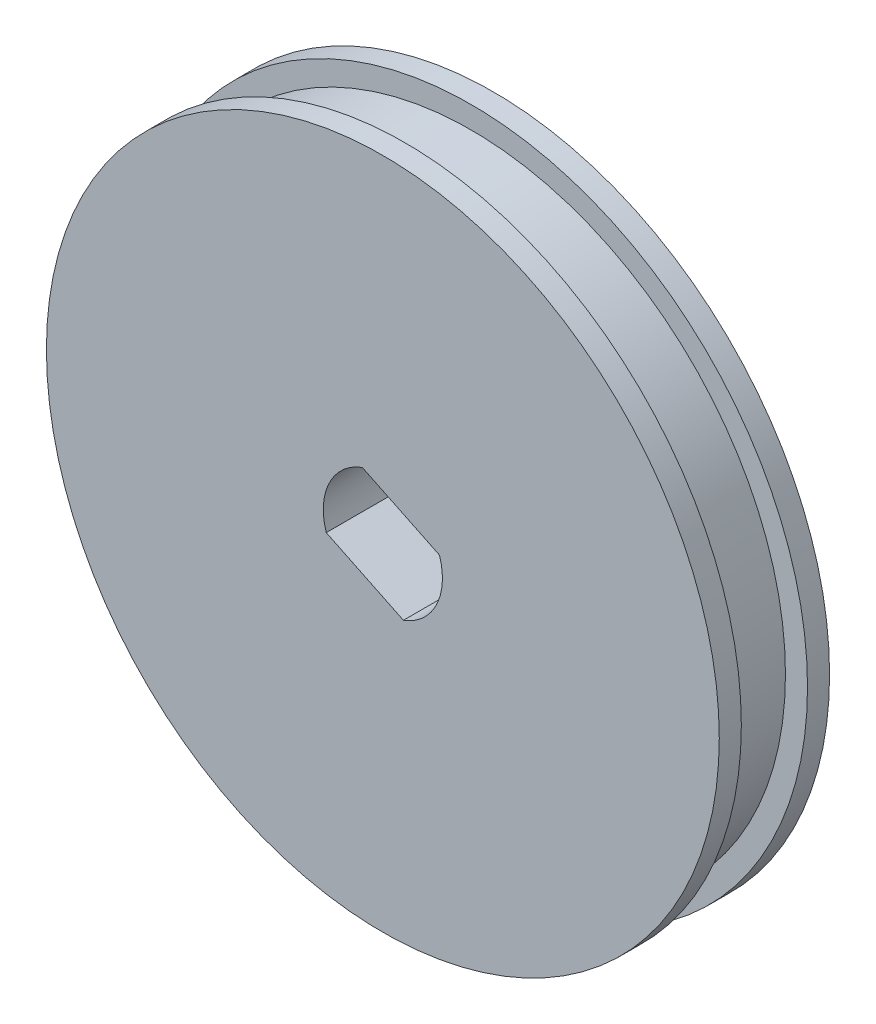
ISO-10303-21;
HEADER;
FILE_DESCRIPTION(('STEP AP214'),'2;1');
FILE_NAME('part.step','',(''),(''),'','','');
FILE_SCHEMA(('AUTOMOTIVE_DESIGN { 1 0 10303 214 1 1 1 1 }'));
ENDSEC;
DATA;
#1=APPLICATION_CONTEXT('core data for automotive mechanical design processes');
#2=APPLICATION_PROTOCOL_DEFINITION('international standard','automotive_design',2000,#1);
#3=PRODUCT_CONTEXT('',#1,'mechanical');
#4=PRODUCT('Part','Part','',(#3));
#5=PRODUCT_RELATED_PRODUCT_CATEGORY('part','',(#4));
#6=PRODUCT_DEFINITION_FORMATION('','',#4);
#7=PRODUCT_DEFINITION_CONTEXT('part definition',#1,'design');
#8=PRODUCT_DEFINITION('design','',#6,#7);
#9=PRODUCT_DEFINITION_SHAPE('','',#8);
#10=(LENGTH_UNIT() NAMED_UNIT(*) SI_UNIT(.MILLI.,.METRE.));
#11=(NAMED_UNIT(*) PLANE_ANGLE_UNIT() SI_UNIT($,.RADIAN.));
#12=(NAMED_UNIT(*) SI_UNIT($,.STERADIAN.) SOLID_ANGLE_UNIT());
#13=UNCERTAINTY_MEASURE_WITH_UNIT(LENGTH_MEASURE(1.E-05),#10,'distance_accuracy_value','');
#14=(GEOMETRIC_REPRESENTATION_CONTEXT(3) GLOBAL_UNCERTAINTY_ASSIGNED_CONTEXT((#13)) GLOBAL_UNIT_ASSIGNED_CONTEXT((#10,
#11,#12)) REPRESENTATION_CONTEXT('',''));
#15=CARTESIAN_POINT('',(0.,0.,0.));
#16=DIRECTION('',(0.,0.,1.));
#17=DIRECTION('',(1.,0.,0.));
#18=AXIS2_PLACEMENT_3D('',#15,#16,#17);
#19=CARTESIAN_POINT('',(22.4165324388438,-13.7076740487496,-1.5));
#20=DIRECTION('',(0.,0.,1.));
#21=DIRECTION('',(-1.,0.,0.));
#22=AXIS2_PLACEMENT_3D('',#19,#20,#21);
#23=CYLINDRICAL_SURFACE('',#22,14.25);
#24=CARTESIAN_POINT('',(22.4165324388438,-13.7076740487496,-1.5));
#25=DIRECTION('',(0.,0.,1.));
#26=DIRECTION('',(1.,0.,0.));
#27=AXIS2_PLACEMENT_3D('',#24,#25,#26);
#28=CIRCLE('',#27,14.25);
#29=CARTESIAN_POINT('',(36.6665324388438,-13.7076740487496,-1.5));
#30=VERTEX_POINT('',#29);
#31=EDGE_CURVE('E11',#30,#30,#28,.T.);
#32=ORIENTED_EDGE('',*,*,#31,.T.);
#33=EDGE_LOOP('',(#32));
#34=FACE_BOUND('',#33,.T.);
#35=CARTESIAN_POINT('',(22.4165324388438,-13.7076740487496,1.5));
#36=DIRECTION('',(0.,0.,1.));
#37=DIRECTION('',(1.,0.,0.));
#38=AXIS2_PLACEMENT_3D('',#35,#36,#37);
#39=CIRCLE('',#38,14.25);
#40=CARTESIAN_POINT('',(36.6665324388438,-13.7076740487496,1.5));
#41=VERTEX_POINT('',#40);
#42=EDGE_CURVE('E44',#41,#41,#39,.T.);
#43=ORIENTED_EDGE('',*,*,#42,.F.);
#44=EDGE_LOOP('',(#43));
#45=FACE_BOUND('',#44,.T.);
#46=ADVANCED_FACE('F41',(#34,#45),#23,.T.);
#47=CARTESIAN_POINT('',(22.4165324388438,-13.7076740487496,-2.5));
#48=DIRECTION('',(0.,0.,1.));
#49=DIRECTION('',(-1.,0.,0.));
#50=AXIS2_PLACEMENT_3D('',#47,#48,#49);
#51=CYLINDRICAL_SURFACE('',#50,15.25);
#52=CARTESIAN_POINT('',(22.4165324388438,-13.7076740487496,-2.5));
#53=DIRECTION('',(0.,0.,1.));
#54=DIRECTION('',(1.,0.,0.));
#55=AXIS2_PLACEMENT_3D('',#52,#53,#54);
#56=CIRCLE('',#55,15.25);
#57=CARTESIAN_POINT('',(37.6665324388438,-13.7076740487496,-2.5));
#58=VERTEX_POINT('',#57);
#59=EDGE_CURVE('E49',#58,#58,#56,.T.);
#60=ORIENTED_EDGE('',*,*,#59,.T.);
#61=EDGE_LOOP('',(#60));
#62=FACE_BOUND('',#61,.T.);
#63=CARTESIAN_POINT('',(22.4165324388438,-13.7076740487496,-1.5));
#64=DIRECTION('',(0.,0.,1.));
#65=DIRECTION('',(1.,0.,0.));
#66=AXIS2_PLACEMENT_3D('',#63,#64,#65);
#67=CIRCLE('',#66,15.25);
#68=CARTESIAN_POINT('',(37.6665324388438,-13.7076740487496,-1.5));
#69=VERTEX_POINT('',#68);
#70=EDGE_CURVE('E127',#69,#69,#67,.T.);
#71=ORIENTED_EDGE('',*,*,#70,.F.);
#72=EDGE_LOOP('',(#71));
#73=FACE_BOUND('',#72,.T.);
#74=ADVANCED_FACE('F138',(#62,#73),#51,.T.);
#75=CARTESIAN_POINT('',(22.4165324388438,-13.7076740487496,-2.5));
#76=DIRECTION('',(0.,0.,-1.));
#77=DIRECTION('',(1.,0.,0.));
#78=AXIS2_PLACEMENT_3D('',#75,#76,#77);
#79=PLANE('',#78);
#80=CARTESIAN_POINT('',(22.4165324388438,-13.7076740487496,-2.5));
#81=DIRECTION('',(0.,0.,1.));
#82=DIRECTION('',(1.,0.,0.));
#83=AXIS2_PLACEMENT_3D('',#80,#81,#82);
#84=CIRCLE('',#83,2.70000000000002);
#85=CARTESIAN_POINT('',(23.3491856746077,-16.2414771077538,-2.5));
#86=VERTEX_POINT('',#85);
#87=CARTESIAN_POINT('',(24.9818423701452,-12.8655428497274,-2.5));
#88=VERTEX_POINT('',#87);
#89=EDGE_CURVE('E110',#86,#88,#84,.T.);
#90=ORIENTED_EDGE('',*,*,#89,.T.);
#91=DIRECTION('',(-0.900249135473721,0.435375118809995,0.));
#92=VECTOR('',#91,1.);
#93=CARTESIAN_POINT('',(24.9818423701452,-12.8655428497274,-2.5));
#94=LINE('',#93,#92);
#95=CARTESIAN_POINT('',(21.48387920308,-11.1738709897454,-2.5));
#96=VERTEX_POINT('',#95);
#97=EDGE_CURVE('E87',#88,#96,#94,.T.);
#98=ORIENTED_EDGE('',*,*,#97,.T.);
#99=CARTESIAN_POINT('',(22.4165324388438,-13.7076740487496,-2.5));
#100=DIRECTION('',(0.,0.,1.));
#101=DIRECTION('',(1.,0.,0.));
#102=AXIS2_PLACEMENT_3D('',#99,#100,#101);
#103=CIRCLE('',#102,2.69999999999998);
#104=CARTESIAN_POINT('',(19.8512225075425,-14.5498052477718,-2.5));
#105=VERTEX_POINT('',#104);
#106=EDGE_CURVE('E105',#96,#105,#103,.T.);
#107=ORIENTED_EDGE('',*,*,#106,.T.);
#108=DIRECTION('',(0.900249135473721,-0.435375118809995,0.));
#109=VECTOR('',#108,1.);
#110=CARTESIAN_POINT('',(19.8512225075425,-14.5498052477718,-2.5));
#111=LINE('',#110,#109);
#112=EDGE_CURVE('E102',#105,#86,#111,.T.);
#113=ORIENTED_EDGE('',*,*,#112,.T.);
#114=EDGE_LOOP('',(#90,#98,#107,#113));
#115=FACE_BOUND('',#114,.T.);
#116=ORIENTED_EDGE('',*,*,#59,.F.);
#117=EDGE_LOOP('',(#116));
#118=FACE_BOUND('',#117,.T.);
#119=ADVANCED_FACE('F143',(#115,#118),#79,.T.);
#120=CARTESIAN_POINT('',(22.4165324388438,-13.7076740487496,-1.5));
#121=DIRECTION('',(0.,0.,-1.));
#122=DIRECTION('',(1.,0.,0.));
#123=AXIS2_PLACEMENT_3D('',#120,#121,#122);
#124=PLANE('',#123);
#125=ORIENTED_EDGE('',*,*,#31,.F.);
#126=EDGE_LOOP('',(#125));
#127=FACE_BOUND('',#126,.T.);
#128=ORIENTED_EDGE('',*,*,#70,.T.);
#129=EDGE_LOOP('',(#128));
#130=FACE_BOUND('',#129,.T.);
#131=ADVANCED_FACE('F147',(#127,#130),#124,.F.);
#132=CARTESIAN_POINT('',(22.4165324388438,-13.7076740487496,2.5));
#133=DIRECTION('',(0.,0.,-1.));
#134=DIRECTION('',(1.,0.,0.));
#135=AXIS2_PLACEMENT_3D('',#132,#133,#134);
#136=CYLINDRICAL_SURFACE('',#135,15.25);
#137=CARTESIAN_POINT('',(22.4165324388438,-13.7076740487496,2.5));
#138=DIRECTION('',(0.,0.,1.));
#139=DIRECTION('',(1.,0.,0.));
#140=AXIS2_PLACEMENT_3D('',#137,#138,#139);
#141=CIRCLE('',#140,15.25);
#142=CARTESIAN_POINT('',(37.6665324388438,-13.7076740487496,2.5));
#143=VERTEX_POINT('',#142);
#144=EDGE_CURVE('E120',#143,#143,#141,.T.);
#145=ORIENTED_EDGE('',*,*,#144,.F.);
#146=EDGE_LOOP('',(#145));
#147=FACE_BOUND('',#146,.T.);
#148=CARTESIAN_POINT('',(22.4165324388438,-13.7076740487496,1.5));
#149=DIRECTION('',(0.,0.,1.));
#150=DIRECTION('',(1.,0.,0.));
#151=AXIS2_PLACEMENT_3D('',#148,#149,#150);
#152=CIRCLE('',#151,15.25);
#153=CARTESIAN_POINT('',(37.6665324388438,-13.7076740487496,1.5));
#154=VERTEX_POINT('',#153);
#155=EDGE_CURVE('E116',#154,#154,#152,.T.);
#156=ORIENTED_EDGE('',*,*,#155,.T.);
#157=EDGE_LOOP('',(#156));
#158=FACE_BOUND('',#157,.T.);
#159=ADVANCED_FACE('F149',(#147,#158),#136,.T.);
#160=CARTESIAN_POINT('',(22.4165324388438,-13.7076740487496,2.5));
#161=DIRECTION('',(0.,0.,1.));
#162=DIRECTION('',(1.,0.,0.));
#163=AXIS2_PLACEMENT_3D('',#160,#161,#162);
#164=PLANE('',#163);
#165=CARTESIAN_POINT('',(22.4165324388438,-13.7076740487496,2.5));
#166=DIRECTION('',(0.,0.,1.));
#167=DIRECTION('',(1.,0.,0.));
#168=AXIS2_PLACEMENT_3D('',#165,#166,#167);
#169=CIRCLE('',#168,2.70000000000002);
#170=CARTESIAN_POINT('',(23.3491856746077,-16.2414771077538,2.5));
#171=VERTEX_POINT('',#170);
#172=CARTESIAN_POINT('',(24.9818423701452,-12.8655428497274,2.5));
#173=VERTEX_POINT('',#172);
#174=EDGE_CURVE('E96',#171,#173,#169,.T.);
#175=ORIENTED_EDGE('',*,*,#174,.F.);
#176=DIRECTION('',(0.900249135473721,-0.435375118809995,0.));
#177=VECTOR('',#176,1.);
#178=CARTESIAN_POINT('',(19.8512225075425,-14.5498052477718,2.5));
#179=LINE('',#178,#177);
#180=CARTESIAN_POINT('',(19.8512225075425,-14.5498052477718,2.5));
#181=VERTEX_POINT('',#180);
#182=EDGE_CURVE('E89',#181,#171,#179,.T.);
#183=ORIENTED_EDGE('',*,*,#182,.F.);
#184=CARTESIAN_POINT('',(22.4165324388438,-13.7076740487496,2.5));
#185=DIRECTION('',(0.,0.,1.));
#186=DIRECTION('',(1.,0.,0.));
#187=AXIS2_PLACEMENT_3D('',#184,#185,#186);
#188=CIRCLE('',#187,2.69999999999998);
#189=CARTESIAN_POINT('',(21.48387920308,-11.1738709897454,2.5));
#190=VERTEX_POINT('',#189);
#191=EDGE_CURVE('E97',#190,#181,#188,.T.);
#192=ORIENTED_EDGE('',*,*,#191,.F.);
#193=DIRECTION('',(-0.900249135473721,0.435375118809995,0.));
#194=VECTOR('',#193,1.);
#195=CARTESIAN_POINT('',(24.9818423701452,-12.8655428497274,2.5));
#196=LINE('',#195,#194);
#197=EDGE_CURVE('E84',#173,#190,#196,.T.);
#198=ORIENTED_EDGE('',*,*,#197,.F.);
#199=EDGE_LOOP('',(#175,#183,#192,#198));
#200=FACE_BOUND('',#199,.T.);
#201=ORIENTED_EDGE('',*,*,#144,.T.);
#202=EDGE_LOOP('',(#201));
#203=FACE_BOUND('',#202,.T.);
#204=ADVANCED_FACE('F93',(#200,#203),#164,.T.);
#205=CARTESIAN_POINT('',(22.4165324388438,-13.7076740487496,1.5));
#206=DIRECTION('',(0.,0.,1.));
#207=DIRECTION('',(1.,0.,0.));
#208=AXIS2_PLACEMENT_3D('',#205,#206,#207);
#209=PLANE('',#208);
#210=ORIENTED_EDGE('',*,*,#42,.T.);
#211=EDGE_LOOP('',(#210));
#212=FACE_BOUND('',#211,.T.);
#213=ORIENTED_EDGE('',*,*,#155,.F.);
#214=EDGE_LOOP('',(#213));
#215=FACE_BOUND('',#214,.T.);
#216=ADVANCED_FACE('F134',(#212,#215),#209,.F.);
#217=CARTESIAN_POINT('',(22.4165324388438,-13.7076740487496,2.5));
#218=DIRECTION('',(0.,0.,-1.));
#219=DIRECTION('',(1.,0.,0.));
#220=AXIS2_PLACEMENT_3D('',#217,#218,#219);
#221=CYLINDRICAL_SURFACE('',#220,2.70000000000002);
#222=ORIENTED_EDGE('',*,*,#89,.F.);
#223=DIRECTION('',(0.,0.,-1.));
#224=VECTOR('',#223,1.);
#225=CARTESIAN_POINT('',(23.3491856746077,-16.2414771077538,2.5));
#226=LINE('',#225,#224);
#227=EDGE_CURVE('E100',#171,#86,#226,.T.);
#228=ORIENTED_EDGE('',*,*,#227,.F.);
#229=ORIENTED_EDGE('',*,*,#174,.T.);
#230=DIRECTION('',(0.,0.,-1.));
#231=VECTOR('',#230,1.);
#232=CARTESIAN_POINT('',(24.9818423701452,-12.8655428497274,2.5));
#233=LINE('',#232,#231);
#234=EDGE_CURVE('E56',#173,#88,#233,.T.);
#235=ORIENTED_EDGE('',*,*,#234,.T.);
#236=EDGE_LOOP('',(#222,#228,#229,#235));
#237=FACE_BOUND('',#236,.T.);
#238=ADVANCED_FACE('F99',(#237),#221,.F.);
#239=CARTESIAN_POINT('',(19.8512225075425,-14.5498052477718,2.5));
#240=DIRECTION('',(-0.435375118809995,-0.900249135473721,0.));
#241=DIRECTION('',(0.900249135473721,-0.435375118809995,0.));
#242=AXIS2_PLACEMENT_3D('',#239,#240,#241);
#243=PLANE('',#242);
#244=ORIENTED_EDGE('',*,*,#112,.F.);
#245=DIRECTION('',(0.,0.,-1.));
#246=VECTOR('',#245,1.);
#247=CARTESIAN_POINT('',(19.8512225075425,-14.5498052477718,2.5));
#248=LINE('',#247,#246);
#249=EDGE_CURVE('E117',#181,#105,#248,.T.);
#250=ORIENTED_EDGE('',*,*,#249,.F.);
#251=ORIENTED_EDGE('',*,*,#182,.T.);
#252=ORIENTED_EDGE('',*,*,#227,.T.);
#253=EDGE_LOOP('',(#244,#250,#251,#252));
#254=FACE_BOUND('',#253,.T.);
#255=ADVANCED_FACE('F166',(#254),#243,.F.);
#256=CARTESIAN_POINT('',(22.4165324388438,-13.7076740487496,2.5));
#257=DIRECTION('',(0.,0.,-1.));
#258=DIRECTION('',(1.,0.,0.));
#259=AXIS2_PLACEMENT_3D('',#256,#257,#258);
#260=CYLINDRICAL_SURFACE('',#259,2.69999999999998);
#261=ORIENTED_EDGE('',*,*,#106,.F.);
#262=DIRECTION('',(0.,0.,-1.));
#263=VECTOR('',#262,1.);
#264=CARTESIAN_POINT('',(21.48387920308,-11.1738709897454,2.5));
#265=LINE('',#264,#263);
#266=EDGE_CURVE('E64',#190,#96,#265,.T.);
#267=ORIENTED_EDGE('',*,*,#266,.F.);
#268=ORIENTED_EDGE('',*,*,#191,.T.);
#269=ORIENTED_EDGE('',*,*,#249,.T.);
#270=EDGE_LOOP('',(#261,#267,#268,#269));
#271=FACE_BOUND('',#270,.T.);
#272=ADVANCED_FACE('F169',(#271),#260,.F.);
#273=CARTESIAN_POINT('',(24.9818423701452,-12.8655428497274,2.5));
#274=DIRECTION('',(0.435375118809995,0.900249135473721,0.));
#275=DIRECTION('',(-0.900249135473721,0.435375118809996,0.));
#276=AXIS2_PLACEMENT_3D('',#273,#274,#275);
#277=PLANE('',#276);
#278=ORIENTED_EDGE('',*,*,#97,.F.);
#279=ORIENTED_EDGE('',*,*,#234,.F.);
#280=ORIENTED_EDGE('',*,*,#197,.T.);
#281=ORIENTED_EDGE('',*,*,#266,.T.);
#282=EDGE_LOOP('',(#278,#279,#280,#281));
#283=FACE_BOUND('',#282,.T.);
#284=ADVANCED_FACE('F83',(#283),#277,.F.);
#285=CLOSED_SHELL('',(#46,#74,#119,#131,#159,#204,#216,#238,#255,#272,#284));
#286=MANIFOLD_SOLID_BREP('B2',#285);
#287=ADVANCED_BREP_SHAPE_REPRESENTATION('',(#18,#286),#14);
#288=SHAPE_DEFINITION_REPRESENTATION(#9,#287);
ENDSEC;
END-ISO-10303-21;
